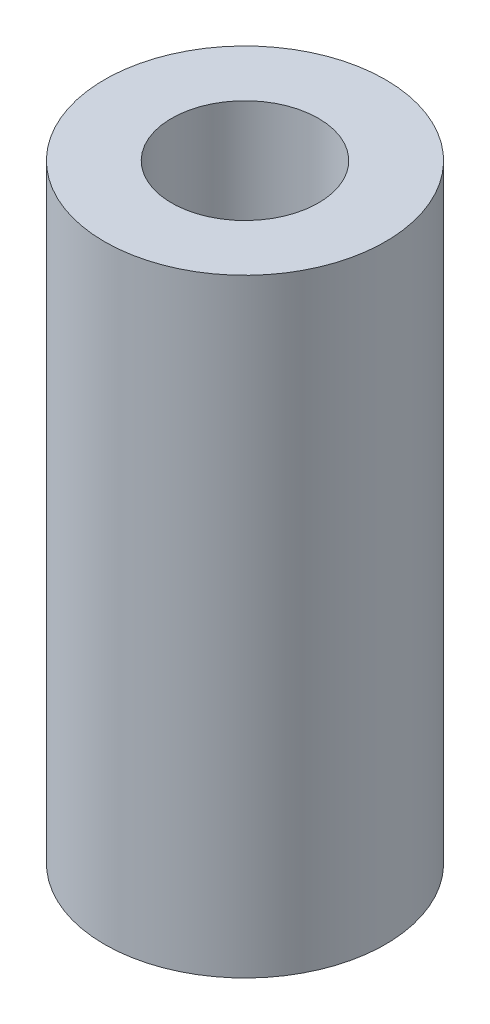
ISO-10303-21;
HEADER;
FILE_DESCRIPTION(('STEP AP214'),'2;1');
FILE_NAME('part.step','',(''),(''),'','','');
FILE_SCHEMA(('AUTOMOTIVE_DESIGN { 1 0 10303 214 1 1 1 1 }'));
ENDSEC;
DATA;
#1=APPLICATION_CONTEXT('core data for automotive mechanical design processes');
#2=APPLICATION_PROTOCOL_DEFINITION('international standard','automotive_design',2000,#1);
#3=PRODUCT_CONTEXT('',#1,'mechanical');
#4=PRODUCT('Part','Part','',(#3));
#5=PRODUCT_RELATED_PRODUCT_CATEGORY('part','',(#4));
#6=PRODUCT_DEFINITION_FORMATION('','',#4);
#7=PRODUCT_DEFINITION_CONTEXT('part definition',#1,'design');
#8=PRODUCT_DEFINITION('design','',#6,#7);
#9=PRODUCT_DEFINITION_SHAPE('','',#8);
#10=(LENGTH_UNIT() NAMED_UNIT(*) SI_UNIT(.MILLI.,.METRE.));
#11=(NAMED_UNIT(*) PLANE_ANGLE_UNIT() SI_UNIT($,.RADIAN.));
#12=(NAMED_UNIT(*) SI_UNIT($,.STERADIAN.) SOLID_ANGLE_UNIT());
#13=UNCERTAINTY_MEASURE_WITH_UNIT(LENGTH_MEASURE(1.E-05),#10,'distance_accuracy_value','');
#14=(GEOMETRIC_REPRESENTATION_CONTEXT(3) GLOBAL_UNCERTAINTY_ASSIGNED_CONTEXT((#13)) GLOBAL_UNIT_ASSIGNED_CONTEXT((#10,
#11,#12)) REPRESENTATION_CONTEXT('',''));
#15=CARTESIAN_POINT('',(0.,0.,0.));
#16=DIRECTION('',(0.,0.,1.));
#17=DIRECTION('',(1.,0.,0.));
#18=AXIS2_PLACEMENT_3D('',#15,#16,#17);
#19=CARTESIAN_POINT('',(0.,-14.2875,0.));
#20=DIRECTION('',(0.,1.,0.));
#21=DIRECTION('',(0.,0.,1.));
#22=AXIS2_PLACEMENT_3D('',#19,#20,#21);
#23=CYLINDRICAL_SURFACE('',#22,2.4892);
#24=CARTESIAN_POINT('',(0.,14.2875,0.));
#25=DIRECTION('',(0.,-1.,0.));
#26=DIRECTION('',(0.,0.,-1.));
#27=AXIS2_PLACEMENT_3D('',#24,#25,#26);
#28=CIRCLE('',#27,2.4892);
#29=CARTESIAN_POINT('',(0.,14.2875,-2.4892));
#30=VERTEX_POINT('',#29);
#31=EDGE_CURVE('E42',#30,#30,#28,.T.);
#32=ORIENTED_EDGE('',*,*,#31,.F.);
#33=EDGE_LOOP('',(#32));
#34=FACE_BOUND('',#33,.T.);
#35=CARTESIAN_POINT('',(0.,-6.35,0.));
#36=DIRECTION('',(0.,-1.,0.));
#37=DIRECTION('',(0.,0.,-1.));
#38=AXIS2_PLACEMENT_3D('',#35,#36,#37);
#39=CIRCLE('',#38,2.4892);
#40=CARTESIAN_POINT('',(0.,-6.35,-2.4892));
#41=VERTEX_POINT('',#40);
#42=EDGE_CURVE('E50',#41,#41,#39,.T.);
#43=ORIENTED_EDGE('',*,*,#42,.T.);
#44=EDGE_LOOP('',(#43));
#45=FACE_BOUND('',#44,.T.);
#46=ADVANCED_FACE('F36',(#34,#45),#23,.F.);
#47=CARTESIAN_POINT('',(0.,-14.2875,0.));
#48=DIRECTION('',(0.,1.,0.));
#49=DIRECTION('',(0.,0.,1.));
#50=AXIS2_PLACEMENT_3D('',#47,#48,#49);
#51=CYLINDRICAL_SURFACE('',#50,4.7625);
#52=CARTESIAN_POINT('',(0.,14.2875,0.));
#53=DIRECTION('',(0.,-1.,0.));
#54=DIRECTION('',(0.,0.,-1.));
#55=AXIS2_PLACEMENT_3D('',#52,#53,#54);
#56=CIRCLE('',#55,4.7625);
#57=CARTESIAN_POINT('',(0.,14.2875,-4.7625));
#58=VERTEX_POINT('',#57);
#59=EDGE_CURVE('E10',#58,#58,#56,.T.);
#60=ORIENTED_EDGE('',*,*,#59,.T.);
#61=EDGE_LOOP('',(#60));
#62=FACE_BOUND('',#61,.T.);
#63=CARTESIAN_POINT('',(0.,-6.35,0.));
#64=DIRECTION('',(0.,-1.,0.));
#65=DIRECTION('',(0.,0.,-1.));
#66=AXIS2_PLACEMENT_3D('',#63,#64,#65);
#67=CIRCLE('',#66,4.7625);
#68=CARTESIAN_POINT('',(0.,-6.35,-4.7625));
#69=VERTEX_POINT('',#68);
#70=EDGE_CURVE('E46',#69,#69,#67,.T.);
#71=ORIENTED_EDGE('',*,*,#70,.F.);
#72=EDGE_LOOP('',(#71));
#73=FACE_BOUND('',#72,.T.);
#74=ADVANCED_FACE('F64',(#62,#73),#51,.T.);
#75=CARTESIAN_POINT('',(0.,14.2875,0.));
#76=DIRECTION('',(0.,-1.,0.));
#77=DIRECTION('',(1.,0.,0.));
#78=AXIS2_PLACEMENT_3D('',#75,#76,#77);
#79=PLANE('',#78);
#80=ORIENTED_EDGE('',*,*,#31,.T.);
#81=EDGE_LOOP('',(#80));
#82=FACE_BOUND('',#81,.T.);
#83=ORIENTED_EDGE('',*,*,#59,.F.);
#84=EDGE_LOOP('',(#83));
#85=FACE_BOUND('',#84,.T.);
#86=ADVANCED_FACE('F60',(#82,#85),#79,.F.);
#87=CARTESIAN_POINT('',(0.,-6.35,0.));
#88=DIRECTION('',(0.,-1.,0.));
#89=DIRECTION('',(0.,0.,-1.));
#90=AXIS2_PLACEMENT_3D('',#87,#88,#89);
#91=PLANE('',#90);
#92=ORIENTED_EDGE('',*,*,#42,.F.);
#93=EDGE_LOOP('',(#92));
#94=FACE_BOUND('',#93,.T.);
#95=ORIENTED_EDGE('',*,*,#70,.T.);
#96=EDGE_LOOP('',(#95));
#97=FACE_BOUND('',#96,.T.);
#98=ADVANCED_FACE('F57',(#94,#97),#91,.T.);
#99=CLOSED_SHELL('',(#46,#74,#86,#98));
#100=MANIFOLD_SOLID_BREP('B2',#99);
#101=ADVANCED_BREP_SHAPE_REPRESENTATION('',(#18,#100),#14);
#102=SHAPE_DEFINITION_REPRESENTATION(#9,#101);
ENDSEC;
END-ISO-10303-21;
